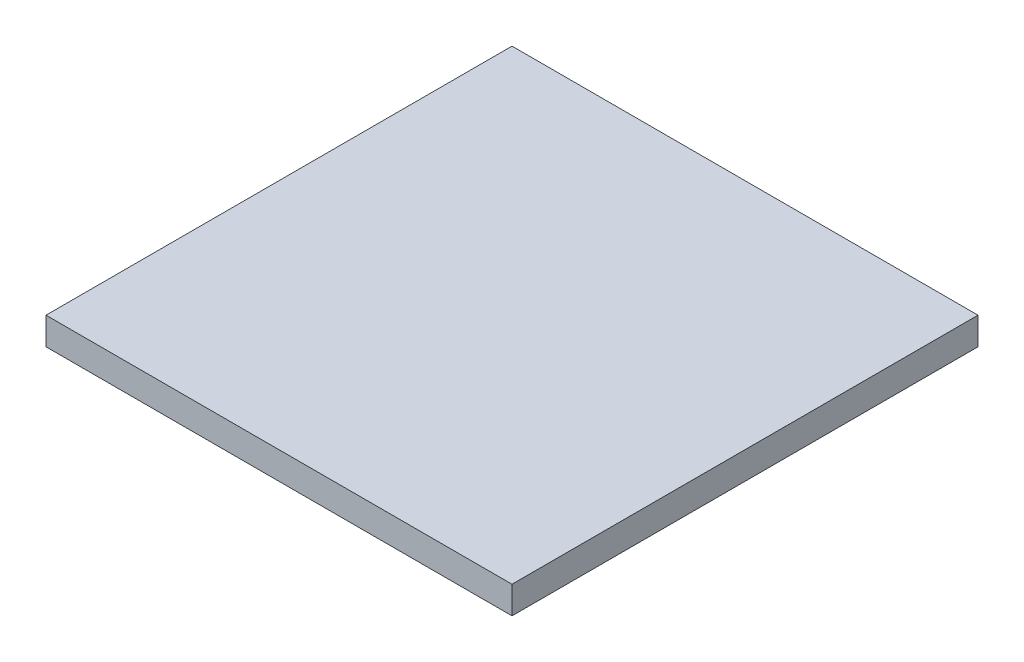
ISO-10303-21;
HEADER;
FILE_DESCRIPTION(('STEP AP214'),'2;1');
FILE_NAME('part.step','',(''),(''),'','','');
FILE_SCHEMA(('AUTOMOTIVE_DESIGN { 1 0 10303 214 1 1 1 1 }'));
ENDSEC;
DATA;
#1=APPLICATION_CONTEXT('core data for automotive mechanical design processes');
#2=APPLICATION_PROTOCOL_DEFINITION('international standard','automotive_design',2000,#1);
#3=PRODUCT_CONTEXT('',#1,'mechanical');
#4=PRODUCT('Part','Part','',(#3));
#5=PRODUCT_RELATED_PRODUCT_CATEGORY('part','',(#4));
#6=PRODUCT_DEFINITION_FORMATION('','',#4);
#7=PRODUCT_DEFINITION_CONTEXT('part definition',#1,'design');
#8=PRODUCT_DEFINITION('design','',#6,#7);
#9=PRODUCT_DEFINITION_SHAPE('','',#8);
#10=(LENGTH_UNIT() NAMED_UNIT(*) SI_UNIT(.MILLI.,.METRE.));
#11=(NAMED_UNIT(*) PLANE_ANGLE_UNIT() SI_UNIT($,.RADIAN.));
#12=(NAMED_UNIT(*) SI_UNIT($,.STERADIAN.) SOLID_ANGLE_UNIT());
#13=UNCERTAINTY_MEASURE_WITH_UNIT(LENGTH_MEASURE(1.E-05),#10,'distance_accuracy_value','');
#14=(GEOMETRIC_REPRESENTATION_CONTEXT(3) GLOBAL_UNCERTAINTY_ASSIGNED_CONTEXT((#13)) GLOBAL_UNIT_ASSIGNED_CONTEXT((#10,
#11,#12)) REPRESENTATION_CONTEXT('',''));
#15=CARTESIAN_POINT('',(0.,0.,0.));
#16=DIRECTION('',(0.,0.,1.));
#17=DIRECTION('',(1.,0.,0.));
#18=AXIS2_PLACEMENT_3D('',#15,#16,#17);
#19=CARTESIAN_POINT('',(-50.1335385087762,4.,-31.4301303328977));
#20=DIRECTION('',(1.,0.,0.));
#21=DIRECTION('',(0.,0.,-1.));
#22=AXIS2_PLACEMENT_3D('',#19,#20,#21);
#23=PLANE('',#22);
#24=DIRECTION('',(0.,0.,1.));
#25=VECTOR('',#24,1.);
#26=CARTESIAN_POINT('',(-50.1335385087762,0.,-31.4301303328977));
#27=LINE('',#26,#25);
#28=CARTESIAN_POINT('',(-50.1335385087762,0.,-31.4301303328977));
#29=VERTEX_POINT('',#28);
#30=CARTESIAN_POINT('',(-50.1335385087762,0.,36.5698695571023));
#31=VERTEX_POINT('',#30);
#32=EDGE_CURVE('E96',#29,#31,#27,.T.);
#33=ORIENTED_EDGE('',*,*,#32,.T.);
#34=DIRECTION('',(0.,-1.,0.));
#35=VECTOR('',#34,1.);
#36=CARTESIAN_POINT('',(-50.1335385087762,4.,36.5698695571023));
#37=LINE('',#36,#35);
#38=CARTESIAN_POINT('',(-50.1335385087762,4.,36.5698695571023));
#39=VERTEX_POINT('',#38);
#40=EDGE_CURVE('E11',#39,#31,#37,.T.);
#41=ORIENTED_EDGE('',*,*,#40,.F.);
#42=DIRECTION('',(0.,0.,1.));
#43=VECTOR('',#42,1.);
#44=CARTESIAN_POINT('',(-50.1335385087762,4.,-31.4301303328977));
#45=LINE('',#44,#43);
#46=CARTESIAN_POINT('',(-50.1335385087762,4.,-31.4301303328977));
#47=VERTEX_POINT('',#46);
#48=EDGE_CURVE('E84',#47,#39,#45,.T.);
#49=ORIENTED_EDGE('',*,*,#48,.F.);
#50=DIRECTION('',(0.,-1.,0.));
#51=VECTOR('',#50,1.);
#52=CARTESIAN_POINT('',(-50.1335385087762,4.,-31.4301303328977));
#53=LINE('',#52,#51);
#54=EDGE_CURVE('E92',#47,#29,#53,.T.);
#55=ORIENTED_EDGE('',*,*,#54,.T.);
#56=EDGE_LOOP('',(#33,#41,#49,#55));
#57=FACE_BOUND('',#56,.T.);
#58=ADVANCED_FACE('F33',(#57),#23,.F.);
#59=CARTESIAN_POINT('',(-50.1335385087762,4.,36.5698695571023));
#60=DIRECTION('',(0.,0.,-1.));
#61=DIRECTION('',(-1.,0.,0.));
#62=AXIS2_PLACEMENT_3D('',#59,#60,#61);
#63=PLANE('',#62);
#64=DIRECTION('',(1.,0.,0.));
#65=VECTOR('',#64,1.);
#66=CARTESIAN_POINT('',(-50.1335385087762,0.,36.5698695571023));
#67=LINE('',#66,#65);
#68=CARTESIAN_POINT('',(17.8664613812238,0.,36.5698695571023));
#69=VERTEX_POINT('',#68);
#70=EDGE_CURVE('E88',#31,#69,#67,.T.);
#71=ORIENTED_EDGE('',*,*,#70,.T.);
#72=DIRECTION('',(0.,-1.,0.));
#73=VECTOR('',#72,1.);
#74=CARTESIAN_POINT('',(17.8664613812238,4.,36.5698695571023));
#75=LINE('',#74,#73);
#76=CARTESIAN_POINT('',(17.8664613812238,4.,36.5698695571023));
#77=VERTEX_POINT('',#76);
#78=EDGE_CURVE('E41',#77,#69,#75,.T.);
#79=ORIENTED_EDGE('',*,*,#78,.F.);
#80=DIRECTION('',(1.,0.,0.));
#81=VECTOR('',#80,1.);
#82=CARTESIAN_POINT('',(-50.1335385087762,4.,36.5698695571023));
#83=LINE('',#82,#81);
#84=EDGE_CURVE('E79',#39,#77,#83,.T.);
#85=ORIENTED_EDGE('',*,*,#84,.F.);
#86=ORIENTED_EDGE('',*,*,#40,.T.);
#87=EDGE_LOOP('',(#71,#79,#85,#86));
#88=FACE_BOUND('',#87,.T.);
#89=ADVANCED_FACE('F87',(#88),#63,.F.);
#90=CARTESIAN_POINT('',(17.8664613812238,4.,-31.4301303328977));
#91=DIRECTION('',(-1.,0.,0.));
#92=DIRECTION('',(0.,0.,1.));
#93=AXIS2_PLACEMENT_3D('',#90,#91,#92);
#94=PLANE('',#93);
#95=DIRECTION('',(0.,0.,-1.));
#96=VECTOR('',#95,1.);
#97=CARTESIAN_POINT('',(17.8664613812238,0.,-31.4301303328977));
#98=LINE('',#97,#96);
#99=CARTESIAN_POINT('',(17.8664613812238,0.,-31.4301303328977));
#100=VERTEX_POINT('',#99);
#101=EDGE_CURVE('E66',#69,#100,#98,.T.);
#102=ORIENTED_EDGE('',*,*,#101,.T.);
#103=DIRECTION('',(0.,-1.,0.));
#104=VECTOR('',#103,1.);
#105=CARTESIAN_POINT('',(17.8664613812238,4.,-31.4301303328977));
#106=LINE('',#105,#104);
#107=CARTESIAN_POINT('',(17.8664613812238,4.,-31.4301303328977));
#108=VERTEX_POINT('',#107);
#109=EDGE_CURVE('E89',#108,#100,#106,.T.);
#110=ORIENTED_EDGE('',*,*,#109,.F.);
#111=DIRECTION('',(0.,0.,-1.));
#112=VECTOR('',#111,1.);
#113=CARTESIAN_POINT('',(17.8664613812238,4.,-31.4301303328977));
#114=LINE('',#113,#112);
#115=EDGE_CURVE('E82',#77,#108,#114,.T.);
#116=ORIENTED_EDGE('',*,*,#115,.F.);
#117=ORIENTED_EDGE('',*,*,#78,.T.);
#118=EDGE_LOOP('',(#102,#110,#116,#117));
#119=FACE_BOUND('',#118,.T.);
#120=ADVANCED_FACE('F90',(#119),#94,.F.);
#121=CARTESIAN_POINT('',(-50.1335385087762,4.,-31.4301303328977));
#122=DIRECTION('',(0.,0.,1.));
#123=DIRECTION('',(1.,0.,0.));
#124=AXIS2_PLACEMENT_3D('',#121,#122,#123);
#125=PLANE('',#124);
#126=DIRECTION('',(-1.,0.,0.));
#127=VECTOR('',#126,1.);
#128=CARTESIAN_POINT('',(-50.1335385087762,0.,-31.4301303328977));
#129=LINE('',#128,#127);
#130=EDGE_CURVE('E72',#100,#29,#129,.T.);
#131=ORIENTED_EDGE('',*,*,#130,.T.);
#132=ORIENTED_EDGE('',*,*,#54,.F.);
#133=DIRECTION('',(-1.,0.,0.));
#134=VECTOR('',#133,1.);
#135=CARTESIAN_POINT('',(-50.1335385087762,4.,-31.4301303328977));
#136=LINE('',#135,#134);
#137=EDGE_CURVE('E49',#108,#47,#136,.T.);
#138=ORIENTED_EDGE('',*,*,#137,.F.);
#139=ORIENTED_EDGE('',*,*,#109,.T.);
#140=EDGE_LOOP('',(#131,#132,#138,#139));
#141=FACE_BOUND('',#140,.T.);
#142=ADVANCED_FACE('F103',(#141),#125,.F.);
#143=CARTESIAN_POINT('',(0.,4.,0.));
#144=DIRECTION('',(0.,1.,0.));
#145=DIRECTION('',(0.,0.,1.));
#146=AXIS2_PLACEMENT_3D('',#143,#144,#145);
#147=PLANE('',#146);
#148=ORIENTED_EDGE('',*,*,#48,.T.);
#149=ORIENTED_EDGE('',*,*,#84,.T.);
#150=ORIENTED_EDGE('',*,*,#115,.T.);
#151=ORIENTED_EDGE('',*,*,#137,.T.);
#152=EDGE_LOOP('',(#148,#149,#150,#151));
#153=FACE_BOUND('',#152,.T.);
#154=ADVANCED_FACE('F80',(#153),#147,.T.);
#155=CARTESIAN_POINT('',(0.,0.,0.));
#156=DIRECTION('',(0.,1.,0.));
#157=DIRECTION('',(0.,0.,1.));
#158=AXIS2_PLACEMENT_3D('',#155,#156,#157);
#159=PLANE('',#158);
#160=ORIENTED_EDGE('',*,*,#32,.F.);
#161=ORIENTED_EDGE('',*,*,#130,.F.);
#162=ORIENTED_EDGE('',*,*,#101,.F.);
#163=ORIENTED_EDGE('',*,*,#70,.F.);
#164=EDGE_LOOP('',(#160,#161,#162,#163));
#165=FACE_BOUND('',#164,.T.);
#166=ADVANCED_FACE('F106',(#165),#159,.F.);
#167=CLOSED_SHELL('',(#58,#89,#120,#142,#154,#166));
#168=MANIFOLD_SOLID_BREP('B2',#167);
#169=ADVANCED_BREP_SHAPE_REPRESENTATION('',(#18,#168),#14);
#170=SHAPE_DEFINITION_REPRESENTATION(#9,#169);
ENDSEC;
END-ISO-10303-21;
